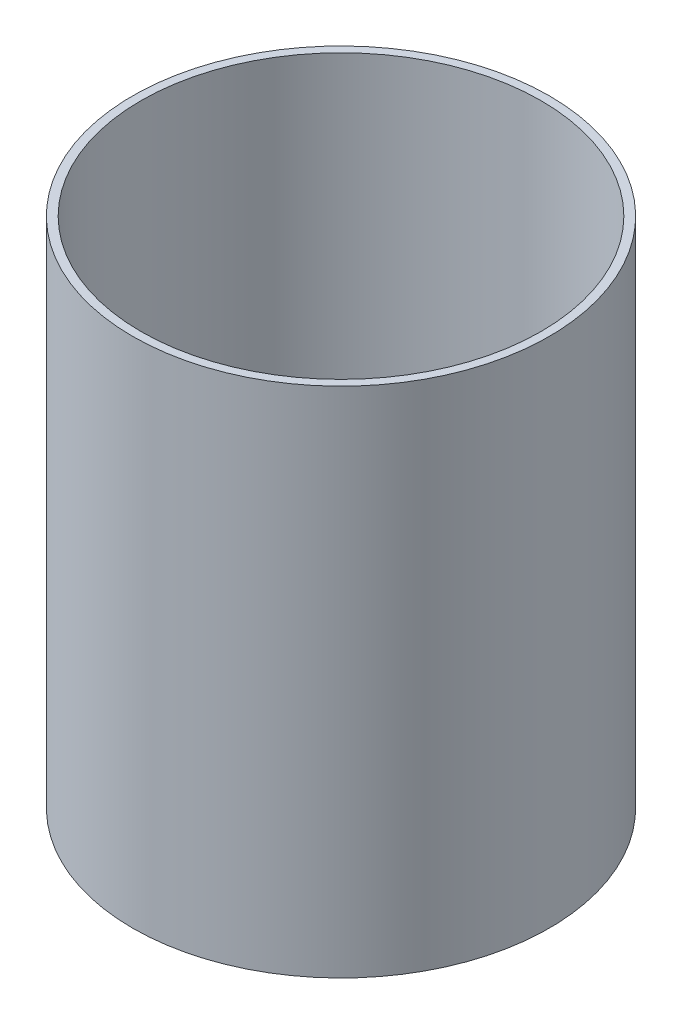
ISO-10303-21;
HEADER;
FILE_DESCRIPTION(('STEP AP214'),'2;1');
FILE_NAME('part.step','',(''),(''),'','','');
FILE_SCHEMA(('AUTOMOTIVE_DESIGN { 1 0 10303 214 1 1 1 1 }'));
ENDSEC;
DATA;
#1=APPLICATION_CONTEXT('core data for automotive mechanical design processes');
#2=APPLICATION_PROTOCOL_DEFINITION('international standard','automotive_design',2000,#1);
#3=PRODUCT_CONTEXT('',#1,'mechanical');
#4=PRODUCT('Part','Part','',(#3));
#5=PRODUCT_RELATED_PRODUCT_CATEGORY('part','',(#4));
#6=PRODUCT_DEFINITION_FORMATION('','',#4);
#7=PRODUCT_DEFINITION_CONTEXT('part definition',#1,'design');
#8=PRODUCT_DEFINITION('design','',#6,#7);
#9=PRODUCT_DEFINITION_SHAPE('','',#8);
#10=(LENGTH_UNIT() NAMED_UNIT(*) SI_UNIT(.MILLI.,.METRE.));
#11=(NAMED_UNIT(*) PLANE_ANGLE_UNIT() SI_UNIT($,.RADIAN.));
#12=(NAMED_UNIT(*) SI_UNIT($,.STERADIAN.) SOLID_ANGLE_UNIT());
#13=UNCERTAINTY_MEASURE_WITH_UNIT(LENGTH_MEASURE(1.E-05),#10,'distance_accuracy_value','');
#14=(GEOMETRIC_REPRESENTATION_CONTEXT(3) GLOBAL_UNCERTAINTY_ASSIGNED_CONTEXT((#13)) GLOBAL_UNIT_ASSIGNED_CONTEXT((#10,
#11,#12)) REPRESENTATION_CONTEXT('',''));
#15=CARTESIAN_POINT('',(0.,0.,0.));
#16=DIRECTION('',(0.,0.,1.));
#17=DIRECTION('',(1.,0.,0.));
#18=AXIS2_PLACEMENT_3D('',#15,#16,#17);
#19=CARTESIAN_POINT('',(0.,123.,0.));
#20=DIRECTION('',(0.,1.,0.));
#21=DIRECTION('',(0.,0.,1.));
#22=AXIS2_PLACEMENT_3D('',#19,#20,#21);
#23=PLANE('',#22);
#24=CARTESIAN_POINT('',(0.,123.,0.));
#25=DIRECTION('',(0.,1.,0.));
#26=DIRECTION('',(0.,0.,1.));
#27=AXIS2_PLACEMENT_3D('',#24,#25,#26);
#28=CIRCLE('',#27,50.);
#29=CARTESIAN_POINT('',(0.,123.,50.));
#30=VERTEX_POINT('',#29);
#31=EDGE_CURVE('E10',#30,#30,#28,.T.);
#32=ORIENTED_EDGE('',*,*,#31,.T.);
#33=EDGE_LOOP('',(#32));
#34=FACE_BOUND('',#33,.T.);
#35=CARTESIAN_POINT('',(0.,123.,0.));
#36=DIRECTION('',(0.,1.,0.));
#37=DIRECTION('',(0.,0.,1.));
#38=AXIS2_PLACEMENT_3D('',#35,#36,#37);
#39=CIRCLE('',#38,48.);
#40=CARTESIAN_POINT('',(0.,123.,48.));
#41=VERTEX_POINT('',#40);
#42=EDGE_CURVE('E43',#41,#41,#39,.T.);
#43=ORIENTED_EDGE('',*,*,#42,.F.);
#44=EDGE_LOOP('',(#43));
#45=FACE_BOUND('',#44,.T.);
#46=ADVANCED_FACE('F32',(#34,#45),#23,.T.);
#47=CARTESIAN_POINT('',(0.,0.,0.));
#48=DIRECTION('',(0.,1.,0.));
#49=DIRECTION('',(0.,0.,1.));
#50=AXIS2_PLACEMENT_3D('',#47,#48,#49);
#51=PLANE('',#50);
#52=CARTESIAN_POINT('',(0.,0.,0.));
#53=DIRECTION('',(0.,1.,0.));
#54=DIRECTION('',(0.,0.,1.));
#55=AXIS2_PLACEMENT_3D('',#52,#53,#54);
#56=CIRCLE('',#55,50.);
#57=CARTESIAN_POINT('',(0.,0.,50.));
#58=VERTEX_POINT('',#57);
#59=EDGE_CURVE('E36',#58,#58,#56,.T.);
#60=ORIENTED_EDGE('',*,*,#59,.F.);
#61=EDGE_LOOP('',(#60));
#62=FACE_BOUND('',#61,.T.);
#63=CARTESIAN_POINT('',(0.,0.,0.));
#64=DIRECTION('',(0.,1.,0.));
#65=DIRECTION('',(0.,0.,1.));
#66=AXIS2_PLACEMENT_3D('',#63,#64,#65);
#67=CIRCLE('',#66,48.);
#68=CARTESIAN_POINT('',(0.,0.,48.));
#69=VERTEX_POINT('',#68);
#70=EDGE_CURVE('E45',#69,#69,#67,.T.);
#71=ORIENTED_EDGE('',*,*,#70,.T.);
#72=EDGE_LOOP('',(#71));
#73=FACE_BOUND('',#72,.T.);
#74=ADVANCED_FACE('F55',(#62,#73),#51,.F.);
#75=CARTESIAN_POINT('',(0.,123.,0.));
#76=DIRECTION('',(0.,-1.,0.));
#77=DIRECTION('',(0.,0.,-1.));
#78=AXIS2_PLACEMENT_3D('',#75,#76,#77);
#79=CYLINDRICAL_SURFACE('',#78,50.);
#80=ORIENTED_EDGE('',*,*,#31,.F.);
#81=EDGE_LOOP('',(#80));
#82=FACE_BOUND('',#81,.T.);
#83=ORIENTED_EDGE('',*,*,#59,.T.);
#84=EDGE_LOOP('',(#83));
#85=FACE_BOUND('',#84,.T.);
#86=ADVANCED_FACE('F34',(#82,#85),#79,.T.);
#87=CARTESIAN_POINT('',(0.,123.,0.));
#88=DIRECTION('',(0.,-1.,0.));
#89=DIRECTION('',(0.,0.,-1.));
#90=AXIS2_PLACEMENT_3D('',#87,#88,#89);
#91=CYLINDRICAL_SURFACE('',#90,48.);
#92=ORIENTED_EDGE('',*,*,#42,.T.);
#93=EDGE_LOOP('',(#92));
#94=FACE_BOUND('',#93,.T.);
#95=ORIENTED_EDGE('',*,*,#70,.F.);
#96=EDGE_LOOP('',(#95));
#97=FACE_BOUND('',#96,.T.);
#98=ADVANCED_FACE('F51',(#94,#97),#91,.F.);
#99=CLOSED_SHELL('',(#46,#74,#86,#98));
#100=MANIFOLD_SOLID_BREP('B2',#99);
#101=ADVANCED_BREP_SHAPE_REPRESENTATION('',(#18,#100),#14);
#102=SHAPE_DEFINITION_REPRESENTATION(#9,#101);
ENDSEC;
END-ISO-10303-21;
